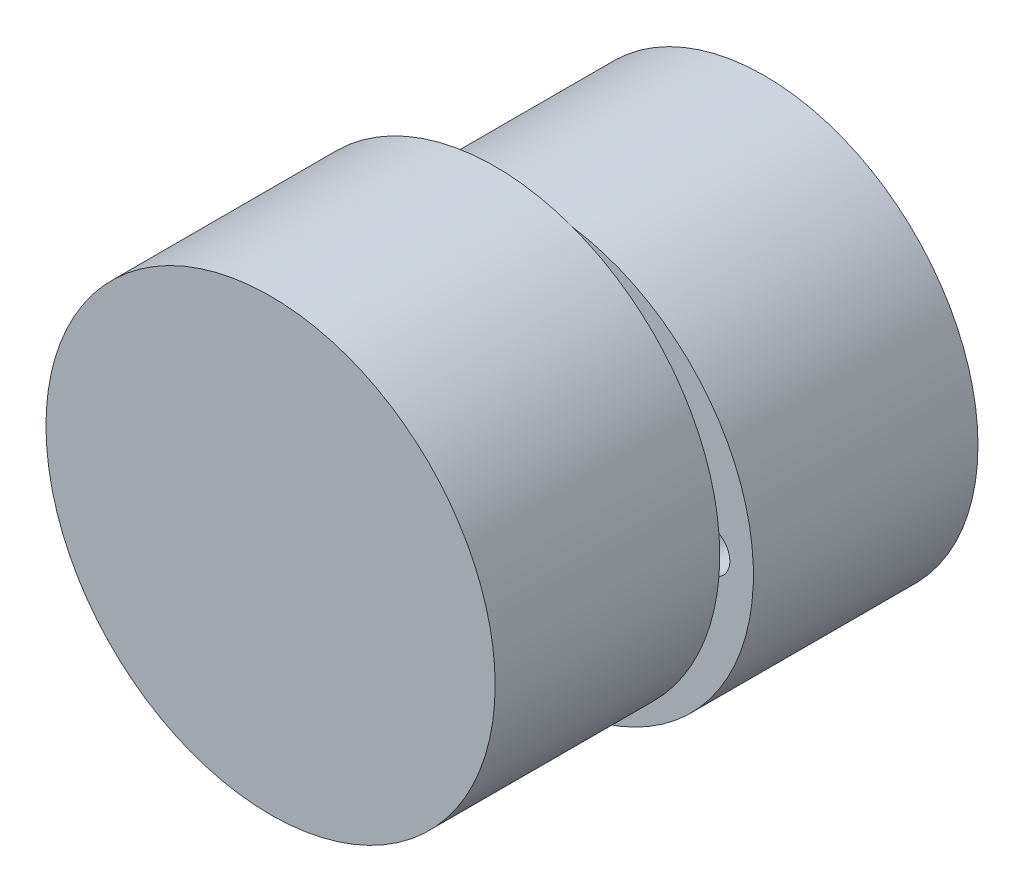
ISO-10303-21;
HEADER;
FILE_DESCRIPTION(('STEP AP214'),'2;1');
FILE_NAME('part.step','',(''),(''),'','','');
FILE_SCHEMA(('AUTOMOTIVE_DESIGN { 1 0 10303 214 1 1 1 1 }'));
ENDSEC;
DATA;
#1=APPLICATION_CONTEXT('core data for automotive mechanical design processes');
#2=APPLICATION_PROTOCOL_DEFINITION('international standard','automotive_design',2000,#1);
#3=PRODUCT_CONTEXT('',#1,'mechanical');
#4=PRODUCT('Part','Part','',(#3));
#5=PRODUCT_RELATED_PRODUCT_CATEGORY('part','',(#4));
#6=PRODUCT_DEFINITION_FORMATION('','',#4);
#7=PRODUCT_DEFINITION_CONTEXT('part definition',#1,'design');
#8=PRODUCT_DEFINITION('design','',#6,#7);
#9=PRODUCT_DEFINITION_SHAPE('','',#8);
#10=(LENGTH_UNIT() NAMED_UNIT(*) SI_UNIT(.MILLI.,.METRE.));
#11=(NAMED_UNIT(*) PLANE_ANGLE_UNIT() SI_UNIT($,.RADIAN.));
#12=(NAMED_UNIT(*) SI_UNIT($,.STERADIAN.) SOLID_ANGLE_UNIT());
#13=UNCERTAINTY_MEASURE_WITH_UNIT(LENGTH_MEASURE(1.E-05),#10,'distance_accuracy_value','');
#14=(GEOMETRIC_REPRESENTATION_CONTEXT(3) GLOBAL_UNCERTAINTY_ASSIGNED_CONTEXT((#13)) GLOBAL_UNIT_ASSIGNED_CONTEXT((#10,
#11,#12)) REPRESENTATION_CONTEXT('',''));
#15=CARTESIAN_POINT('',(0.,0.,0.));
#16=DIRECTION('',(0.,0.,1.));
#17=DIRECTION('',(1.,0.,0.));
#18=AXIS2_PLACEMENT_3D('',#15,#16,#17);
#19=CARTESIAN_POINT('',(0.,0.,10.));
#20=DIRECTION('',(0.,0.,1.));
#21=DIRECTION('',(1.,0.,0.));
#22=AXIS2_PLACEMENT_3D('',#19,#20,#21);
#23=PLANE('',#22);
#24=CARTESIAN_POINT('',(-2.,0.,10.));
#25=DIRECTION('',(0.,0.,1.));
#26=DIRECTION('',(1.,0.,0.));
#27=AXIS2_PLACEMENT_3D('',#24,#25,#26);
#28=CIRCLE('',#27,10.);
#29=CARTESIAN_POINT('',(7.96565789473685,0.828047537928324,10.));
#30=VERTEX_POINT('',#29);
#31=CARTESIAN_POINT('',(1.4375,9.39061200082295,10.));
#32=VERTEX_POINT('',#31);
#33=EDGE_CURVE('E46',#30,#32,#28,.T.);
#34=ORIENTED_EDGE('',*,*,#33,.F.);
#35=CARTESIAN_POINT('',(7.5,0.,10.));
#36=DIRECTION('',(0.,0.,1.));
#37=DIRECTION('',(1.,0.,0.));
#38=AXIS2_PLACEMENT_3D('',#35,#36,#37);
#39=CIRCLE('',#38,0.95);
#40=CARTESIAN_POINT('',(7.96565789473684,-0.828047537928434,10.));
#41=VERTEX_POINT('',#40);
#42=EDGE_CURVE('E68',#41,#30,#39,.T.);
#43=ORIENTED_EDGE('',*,*,#42,.F.);
#44=CARTESIAN_POINT('',(1.4375,-9.39061200082295,10.));
#45=VERTEX_POINT('',#44);
#46=EDGE_CURVE('E11',#45,#41,#28,.T.);
#47=ORIENTED_EDGE('',*,*,#46,.F.);
#48=CARTESIAN_POINT('',(0.,0.,10.));
#49=DIRECTION('',(0.,0.,1.));
#50=DIRECTION('',(1.,0.,0.));
#51=AXIS2_PLACEMENT_3D('',#48,#49,#50);
#52=CIRCLE('',#51,9.5);
#53=EDGE_CURVE('E56',#45,#32,#52,.T.);
#54=ORIENTED_EDGE('',*,*,#53,.T.);
#55=EDGE_LOOP('',(#34,#43,#47,#54));
#56=FACE_BOUND('',#55,.T.);
#57=ADVANCED_FACE('F35',(#56),#23,.T.);
#58=CARTESIAN_POINT('',(0.,0.,0.));
#59=DIRECTION('',(0.,0.,1.));
#60=DIRECTION('',(1.,0.,0.));
#61=AXIS2_PLACEMENT_3D('',#58,#59,#60);
#62=PLANE('',#61);
#63=CARTESIAN_POINT('',(0.,0.,0.));
#64=DIRECTION('',(0.,0.,-1.));
#65=DIRECTION('',(-1.,0.,0.));
#66=AXIS2_PLACEMENT_3D('',#63,#64,#65);
#67=CIRCLE('',#66,5.5);
#68=CARTESIAN_POINT('',(-5.5,0.,0.));
#69=VERTEX_POINT('',#68);
#70=EDGE_CURVE('E266',#69,#69,#67,.T.);
#71=ORIENTED_EDGE('',*,*,#70,.F.);
#72=EDGE_LOOP('',(#71));
#73=FACE_BOUND('',#72,.T.);
#74=CARTESIAN_POINT('',(0.,0.,0.));
#75=DIRECTION('',(0.,0.,1.));
#76=DIRECTION('',(1.,0.,0.));
#77=AXIS2_PLACEMENT_3D('',#74,#75,#76);
#78=CIRCLE('',#77,9.5);
#79=CARTESIAN_POINT('',(9.5,0.,0.));
#80=VERTEX_POINT('',#79);
#81=EDGE_CURVE('E132',#80,#80,#78,.T.);
#82=ORIENTED_EDGE('',*,*,#81,.F.);
#83=EDGE_LOOP('',(#82));
#84=FACE_BOUND('',#83,.T.);
#85=CARTESIAN_POINT('',(-7.5,0.,0.));
#86=DIRECTION('',(0.,0.,1.));
#87=DIRECTION('',(1.,0.,0.));
#88=AXIS2_PLACEMENT_3D('',#85,#86,#87);
#89=CIRCLE('',#88,0.95);
#90=CARTESIAN_POINT('',(-6.55,0.,0.));
#91=VERTEX_POINT('',#90);
#92=EDGE_CURVE('E127',#91,#91,#89,.T.);
#93=ORIENTED_EDGE('',*,*,#92,.T.);
#94=EDGE_LOOP('',(#93));
#95=FACE_BOUND('',#94,.T.);
#96=CARTESIAN_POINT('',(-5.3033008588991,5.30330085889912,0.));
#97=DIRECTION('',(0.,0.,1.));
#98=DIRECTION('',(1.,0.,0.));
#99=AXIS2_PLACEMENT_3D('',#96,#97,#98);
#100=CIRCLE('',#99,0.95);
#101=CARTESIAN_POINT('',(-4.3533008588991,5.30330085889912,0.));
#102=VERTEX_POINT('',#101);
#103=EDGE_CURVE('E121',#102,#102,#100,.T.);
#104=ORIENTED_EDGE('',*,*,#103,.T.);
#105=EDGE_LOOP('',(#104));
#106=FACE_BOUND('',#105,.T.);
#107=CARTESIAN_POINT('',(0.,7.5,0.));
#108=DIRECTION('',(0.,0.,1.));
#109=DIRECTION('',(1.,0.,0.));
#110=AXIS2_PLACEMENT_3D('',#107,#108,#109);
#111=CIRCLE('',#110,0.95);
#112=CARTESIAN_POINT('',(0.950000000000026,7.5,0.));
#113=VERTEX_POINT('',#112);
#114=EDGE_CURVE('E115',#113,#113,#111,.T.);
#115=ORIENTED_EDGE('',*,*,#114,.T.);
#116=EDGE_LOOP('',(#115));
#117=FACE_BOUND('',#116,.T.);
#118=CARTESIAN_POINT('',(5.30330085889913,5.30330085889908,0.));
#119=DIRECTION('',(0.,0.,1.));
#120=DIRECTION('',(1.,0.,0.));
#121=AXIS2_PLACEMENT_3D('',#118,#119,#120);
#122=CIRCLE('',#121,0.95);
#123=CARTESIAN_POINT('',(6.25330085889913,5.30330085889908,0.));
#124=VERTEX_POINT('',#123);
#125=EDGE_CURVE('E72',#124,#124,#122,.T.);
#126=ORIENTED_EDGE('',*,*,#125,.T.);
#127=EDGE_LOOP('',(#126));
#128=FACE_BOUND('',#127,.T.);
#129=CARTESIAN_POINT('',(7.5,0.,0.));
#130=DIRECTION('',(0.,0.,1.));
#131=DIRECTION('',(1.,0.,0.));
#132=AXIS2_PLACEMENT_3D('',#129,#130,#131);
#133=CIRCLE('',#132,0.95);
#134=CARTESIAN_POINT('',(8.45,0.,0.));
#135=VERTEX_POINT('',#134);
#136=EDGE_CURVE('E75',#135,#135,#133,.T.);
#137=ORIENTED_EDGE('',*,*,#136,.T.);
#138=EDGE_LOOP('',(#137));
#139=FACE_BOUND('',#138,.T.);
#140=CARTESIAN_POINT('',(5.30330085889906,-5.30330085889915,0.));
#141=DIRECTION('',(0.,0.,1.));
#142=DIRECTION('',(1.,0.,0.));
#143=AXIS2_PLACEMENT_3D('',#140,#141,#142);
#144=CIRCLE('',#143,0.95);
#145=CARTESIAN_POINT('',(6.25330085889906,-5.30330085889915,0.));
#146=VERTEX_POINT('',#145);
#147=EDGE_CURVE('E102',#146,#146,#144,.T.);
#148=ORIENTED_EDGE('',*,*,#147,.T.);
#149=EDGE_LOOP('',(#148));
#150=FACE_BOUND('',#149,.T.);
#151=CARTESIAN_POINT('',(0.,-7.5,0.));
#152=DIRECTION('',(0.,0.,1.));
#153=DIRECTION('',(1.,0.,0.));
#154=AXIS2_PLACEMENT_3D('',#151,#152,#153);
#155=CIRCLE('',#154,0.95);
#156=CARTESIAN_POINT('',(0.949999999999921,-7.5,0.));
#157=VERTEX_POINT('',#156);
#158=EDGE_CURVE('E95',#157,#157,#155,.T.);
#159=ORIENTED_EDGE('',*,*,#158,.T.);
#160=EDGE_LOOP('',(#159));
#161=FACE_BOUND('',#160,.T.);
#162=CARTESIAN_POINT('',(-5.30330085889917,-5.30330085889904,0.));
#163=DIRECTION('',(0.,0.,1.));
#164=DIRECTION('',(1.,0.,0.));
#165=AXIS2_PLACEMENT_3D('',#162,#163,#164);
#166=CIRCLE('',#165,0.950000000000001);
#167=CARTESIAN_POINT('',(-4.35330085889917,-5.30330085889904,0.));
#168=VERTEX_POINT('',#167);
#169=EDGE_CURVE('E92',#168,#168,#166,.T.);
#170=ORIENTED_EDGE('',*,*,#169,.T.);
#171=EDGE_LOOP('',(#170));
#172=FACE_BOUND('',#171,.T.);
#173=ADVANCED_FACE('F139',(#73,#84,#95,#106,#117,#128,#139,#150,#161,#172),#62,.F.);
#174=CARTESIAN_POINT('',(0.,0.,10.));
#175=DIRECTION('',(0.,0.,-1.));
#176=DIRECTION('',(-1.,0.,0.));
#177=AXIS2_PLACEMENT_3D('',#174,#175,#176);
#178=CYLINDRICAL_SURFACE('',#177,9.5);
#179=EDGE_CURVE('E44',#32,#45,#52,.T.);
#180=ORIENTED_EDGE('',*,*,#179,.F.);
#181=ORIENTED_EDGE('',*,*,#53,.F.);
#182=EDGE_LOOP('',(#180,#181));
#183=FACE_BOUND('',#182,.T.);
#184=ORIENTED_EDGE('',*,*,#81,.T.);
#185=EDGE_LOOP('',(#184));
#186=FACE_BOUND('',#185,.T.);
#187=ADVANCED_FACE('F37',(#183,#186),#178,.T.);
#188=CARTESIAN_POINT('',(-7.5,0.,10.));
#189=DIRECTION('',(0.,0.,-1.));
#190=DIRECTION('',(-1.,0.,0.));
#191=AXIS2_PLACEMENT_3D('',#188,#189,#190);
#192=CYLINDRICAL_SURFACE('',#191,0.95);
#193=CARTESIAN_POINT('',(-7.5,0.,10.));
#194=DIRECTION('',(0.,0.,1.));
#195=DIRECTION('',(1.,0.,0.));
#196=AXIS2_PLACEMENT_3D('',#193,#194,#195);
#197=CIRCLE('',#196,0.95);
#198=CARTESIAN_POINT('',(-6.55,0.,10.));
#199=VERTEX_POINT('',#198);
#200=EDGE_CURVE('E118',#199,#199,#197,.T.);
#201=ORIENTED_EDGE('',*,*,#200,.T.);
#202=EDGE_LOOP('',(#201));
#203=FACE_BOUND('',#202,.T.);
#204=ORIENTED_EDGE('',*,*,#92,.F.);
#205=EDGE_LOOP('',(#204));
#206=FACE_BOUND('',#205,.T.);
#207=ADVANCED_FACE('F185',(#203,#206),#192,.F.);
#208=CARTESIAN_POINT('',(-5.3033008588991,5.30330085889912,10.));
#209=DIRECTION('',(0.,0.,-1.));
#210=DIRECTION('',(-1.,0.,0.));
#211=AXIS2_PLACEMENT_3D('',#208,#209,#210);
#212=CYLINDRICAL_SURFACE('',#211,0.95);
#213=CARTESIAN_POINT('',(-5.3033008588991,5.30330085889912,10.));
#214=DIRECTION('',(0.,0.,1.));
#215=DIRECTION('',(1.,0.,0.));
#216=AXIS2_PLACEMENT_3D('',#213,#214,#215);
#217=CIRCLE('',#216,0.95);
#218=CARTESIAN_POINT('',(-4.3533008588991,5.30330085889912,10.));
#219=VERTEX_POINT('',#218);
#220=EDGE_CURVE('E112',#219,#219,#217,.T.);
#221=ORIENTED_EDGE('',*,*,#220,.T.);
#222=EDGE_LOOP('',(#221));
#223=FACE_BOUND('',#222,.T.);
#224=ORIENTED_EDGE('',*,*,#103,.F.);
#225=EDGE_LOOP('',(#224));
#226=FACE_BOUND('',#225,.T.);
#227=ADVANCED_FACE('F188',(#223,#226),#212,.F.);
#228=CARTESIAN_POINT('',(0.,7.5,10.));
#229=DIRECTION('',(0.,0.,-1.));
#230=DIRECTION('',(-1.,0.,0.));
#231=AXIS2_PLACEMENT_3D('',#228,#229,#230);
#232=CYLINDRICAL_SURFACE('',#231,0.95);
#233=CARTESIAN_POINT('',(0.,7.5,10.));
#234=DIRECTION('',(0.,0.,1.));
#235=DIRECTION('',(1.,0.,0.));
#236=AXIS2_PLACEMENT_3D('',#233,#234,#235);
#237=CIRCLE('',#236,0.95);
#238=CARTESIAN_POINT('',(0.950000000000026,7.5,10.));
#239=VERTEX_POINT('',#238);
#240=EDGE_CURVE('E99',#239,#239,#237,.T.);
#241=ORIENTED_EDGE('',*,*,#240,.T.);
#242=EDGE_LOOP('',(#241));
#243=FACE_BOUND('',#242,.T.);
#244=ORIENTED_EDGE('',*,*,#114,.F.);
#245=EDGE_LOOP('',(#244));
#246=FACE_BOUND('',#245,.T.);
#247=ADVANCED_FACE('F192',(#243,#246),#232,.F.);
#248=CARTESIAN_POINT('',(5.30330085889913,5.30330085889908,10.));
#249=DIRECTION('',(0.,0.,-1.));
#250=DIRECTION('',(-1.,0.,0.));
#251=AXIS2_PLACEMENT_3D('',#248,#249,#250);
#252=CYLINDRICAL_SURFACE('',#251,0.95);
#253=CARTESIAN_POINT('',(5.30330085889913,5.30330085889908,10.));
#254=DIRECTION('',(0.,0.,1.));
#255=DIRECTION('',(1.,0.,0.));
#256=AXIS2_PLACEMENT_3D('',#253,#254,#255);
#257=CIRCLE('',#256,0.95);
#258=CARTESIAN_POINT('',(6.25330085889913,5.30330085889908,10.));
#259=VERTEX_POINT('',#258);
#260=EDGE_CURVE('E105',#259,#259,#257,.T.);
#261=ORIENTED_EDGE('',*,*,#260,.T.);
#262=EDGE_LOOP('',(#261));
#263=FACE_BOUND('',#262,.T.);
#264=ORIENTED_EDGE('',*,*,#125,.F.);
#265=EDGE_LOOP('',(#264));
#266=FACE_BOUND('',#265,.T.);
#267=ADVANCED_FACE('F196',(#263,#266),#252,.F.);
#268=CARTESIAN_POINT('',(7.5,0.,10.));
#269=DIRECTION('',(0.,0.,-1.));
#270=DIRECTION('',(-1.,0.,0.));
#271=AXIS2_PLACEMENT_3D('',#268,#269,#270);
#272=CYLINDRICAL_SURFACE('',#271,0.95);
#273=EDGE_CURVE('E65',#30,#41,#39,.T.);
#274=ORIENTED_EDGE('',*,*,#273,.T.);
#275=ORIENTED_EDGE('',*,*,#42,.T.);
#276=EDGE_LOOP('',(#274,#275));
#277=FACE_BOUND('',#276,.T.);
#278=ORIENTED_EDGE('',*,*,#136,.F.);
#279=EDGE_LOOP('',(#278));
#280=FACE_BOUND('',#279,.T.);
#281=ADVANCED_FACE('F66',(#277,#280),#272,.F.);
#282=CARTESIAN_POINT('',(5.30330085889906,-5.30330085889915,10.));
#283=DIRECTION('',(0.,0.,-1.));
#284=DIRECTION('',(-1.,0.,0.));
#285=AXIS2_PLACEMENT_3D('',#282,#283,#284);
#286=CYLINDRICAL_SURFACE('',#285,0.95);
#287=CARTESIAN_POINT('',(5.30330085889906,-5.30330085889915,10.));
#288=DIRECTION('',(0.,0.,1.));
#289=DIRECTION('',(1.,0.,0.));
#290=AXIS2_PLACEMENT_3D('',#287,#288,#289);
#291=CIRCLE('',#290,0.95);
#292=CARTESIAN_POINT('',(6.25330085889906,-5.30330085889915,10.));
#293=VERTEX_POINT('',#292);
#294=EDGE_CURVE('E91',#293,#293,#291,.T.);
#295=ORIENTED_EDGE('',*,*,#294,.T.);
#296=EDGE_LOOP('',(#295));
#297=FACE_BOUND('',#296,.T.);
#298=ORIENTED_EDGE('',*,*,#147,.F.);
#299=EDGE_LOOP('',(#298));
#300=FACE_BOUND('',#299,.T.);
#301=ADVANCED_FACE('F171',(#297,#300),#286,.F.);
#302=CARTESIAN_POINT('',(0.,-7.5,10.));
#303=DIRECTION('',(0.,0.,-1.));
#304=DIRECTION('',(-1.,0.,0.));
#305=AXIS2_PLACEMENT_3D('',#302,#303,#304);
#306=CYLINDRICAL_SURFACE('',#305,0.95);
#307=CARTESIAN_POINT('',(0.,-7.5,10.));
#308=DIRECTION('',(0.,0.,1.));
#309=DIRECTION('',(1.,0.,0.));
#310=AXIS2_PLACEMENT_3D('',#307,#308,#309);
#311=CIRCLE('',#310,0.95);
#312=CARTESIAN_POINT('',(0.949999999999921,-7.5,10.));
#313=VERTEX_POINT('',#312);
#314=EDGE_CURVE('E96',#313,#313,#311,.T.);
#315=ORIENTED_EDGE('',*,*,#314,.T.);
#316=EDGE_LOOP('',(#315));
#317=FACE_BOUND('',#316,.T.);
#318=ORIENTED_EDGE('',*,*,#158,.F.);
#319=EDGE_LOOP('',(#318));
#320=FACE_BOUND('',#319,.T.);
#321=ADVANCED_FACE('F162',(#317,#320),#306,.F.);
#322=CARTESIAN_POINT('',(-5.30330085889917,-5.30330085889904,10.));
#323=DIRECTION('',(0.,0.,-1.));
#324=DIRECTION('',(-1.,0.,0.));
#325=AXIS2_PLACEMENT_3D('',#322,#323,#324);
#326=CYLINDRICAL_SURFACE('',#325,0.950000000000001);
#327=CARTESIAN_POINT('',(-5.30330085889917,-5.30330085889904,10.));
#328=DIRECTION('',(0.,0.,1.));
#329=DIRECTION('',(1.,0.,0.));
#330=AXIS2_PLACEMENT_3D('',#327,#328,#329);
#331=CIRCLE('',#330,0.950000000000001);
#332=CARTESIAN_POINT('',(-4.35330085889917,-5.30330085889904,10.));
#333=VERTEX_POINT('',#332);
#334=EDGE_CURVE('E88',#333,#333,#331,.T.);
#335=ORIENTED_EDGE('',*,*,#334,.T.);
#336=EDGE_LOOP('',(#335));
#337=FACE_BOUND('',#336,.T.);
#338=ORIENTED_EDGE('',*,*,#169,.F.);
#339=EDGE_LOOP('',(#338));
#340=FACE_BOUND('',#339,.T.);
#341=ADVANCED_FACE('F159',(#337,#340),#326,.F.);
#342=CARTESIAN_POINT('',(-2.,0.,20.));
#343=DIRECTION('',(0.,0.,1.));
#344=DIRECTION('',(1.,0.,0.));
#345=AXIS2_PLACEMENT_3D('',#342,#343,#344);
#346=PLANE('',#345);
#347=CARTESIAN_POINT('',(-2.,0.,20.));
#348=DIRECTION('',(0.,0.,1.));
#349=DIRECTION('',(1.,0.,0.));
#350=AXIS2_PLACEMENT_3D('',#347,#348,#349);
#351=CIRCLE('',#350,10.);
#352=CARTESIAN_POINT('',(8.,0.,20.));
#353=VERTEX_POINT('',#352);
#354=EDGE_CURVE('E84',#353,#353,#351,.T.);
#355=ORIENTED_EDGE('',*,*,#354,.T.);
#356=EDGE_LOOP('',(#355));
#357=FACE_BOUND('',#356,.T.);
#358=ADVANCED_FACE('F161',(#357),#346,.T.);
#359=CARTESIAN_POINT('',(-2.,0.,20.));
#360=DIRECTION('',(0.,0.,-1.));
#361=DIRECTION('',(-1.,0.,0.));
#362=AXIS2_PLACEMENT_3D('',#359,#360,#361);
#363=CYLINDRICAL_SURFACE('',#362,10.);
#364=ORIENTED_EDGE('',*,*,#354,.F.);
#365=EDGE_LOOP('',(#364));
#366=FACE_BOUND('',#365,.T.);
#367=ORIENTED_EDGE('',*,*,#33,.T.);
#368=EDGE_CURVE('E47',#32,#45,#28,.T.);
#369=ORIENTED_EDGE('',*,*,#368,.T.);
#370=ORIENTED_EDGE('',*,*,#46,.T.);
#371=EDGE_CURVE('E76',#41,#30,#28,.T.);
#372=ORIENTED_EDGE('',*,*,#371,.T.);
#373=EDGE_LOOP('',(#367,#369,#370,#372));
#374=FACE_BOUND('',#373,.T.);
#375=ADVANCED_FACE('F80',(#366,#374),#363,.T.);
#376=CARTESIAN_POINT('',(-2.,0.,10.));
#377=DIRECTION('',(0.,0.,1.));
#378=DIRECTION('',(1.,0.,0.));
#379=AXIS2_PLACEMENT_3D('',#376,#377,#378);
#380=PLANE('',#379);
#381=ORIENTED_EDGE('',*,*,#368,.F.);
#382=ORIENTED_EDGE('',*,*,#179,.T.);
#383=EDGE_LOOP('',(#381,#382));
#384=FACE_BOUND('',#383,.T.);
#385=ADVANCED_FACE('F225',(#384),#380,.F.);
#386=ORIENTED_EDGE('',*,*,#273,.F.);
#387=ORIENTED_EDGE('',*,*,#371,.F.);
#388=EDGE_LOOP('',(#386,#387));
#389=FACE_BOUND('',#388,.T.);
#390=ADVANCED_FACE('F77',(#389),#380,.F.);
#391=ORIENTED_EDGE('',*,*,#334,.F.);
#392=EDGE_LOOP('',(#391));
#393=FACE_BOUND('',#392,.T.);
#394=ADVANCED_FACE('F213',(#393),#380,.F.);
#395=ORIENTED_EDGE('',*,*,#294,.F.);
#396=EDGE_LOOP('',(#395));
#397=FACE_BOUND('',#396,.T.);
#398=ADVANCED_FACE('F210',(#397),#380,.F.);
#399=ORIENTED_EDGE('',*,*,#260,.F.);
#400=EDGE_LOOP('',(#399));
#401=FACE_BOUND('',#400,.T.);
#402=ADVANCED_FACE('F212',(#401),#380,.F.);
#403=ORIENTED_EDGE('',*,*,#220,.F.);
#404=EDGE_LOOP('',(#403));
#405=FACE_BOUND('',#404,.T.);
#406=ADVANCED_FACE('F219',(#405),#380,.F.);
#407=ORIENTED_EDGE('',*,*,#200,.F.);
#408=EDGE_LOOP('',(#407));
#409=FACE_BOUND('',#408,.T.);
#410=ADVANCED_FACE('F230',(#409),#380,.F.);
#411=ORIENTED_EDGE('',*,*,#240,.F.);
#412=EDGE_LOOP('',(#411));
#413=FACE_BOUND('',#412,.T.);
#414=ADVANCED_FACE('F231',(#413),#380,.F.);
#415=ORIENTED_EDGE('',*,*,#314,.F.);
#416=EDGE_LOOP('',(#415));
#417=FACE_BOUND('',#416,.T.);
#418=ADVANCED_FACE('F222',(#417),#380,.F.);
#419=CARTESIAN_POINT('',(0.,0.,1.2));
#420=DIRECTION('',(0.,0.,-1.));
#421=DIRECTION('',(-1.,0.,0.));
#422=AXIS2_PLACEMENT_3D('',#419,#420,#421);
#423=CYLINDRICAL_SURFACE('',#422,5.5);
#424=CARTESIAN_POINT('',(0.,0.,1.2));
#425=DIRECTION('',(0.,0.,-1.));
#426=DIRECTION('',(-1.,0.,0.));
#427=AXIS2_PLACEMENT_3D('',#424,#425,#426);
#428=CIRCLE('',#427,5.5);
#429=CARTESIAN_POINT('',(-5.5,0.,1.2));
#430=VERTEX_POINT('',#429);
#431=EDGE_CURVE('E263',#430,#430,#428,.T.);
#432=ORIENTED_EDGE('',*,*,#431,.F.);
#433=EDGE_LOOP('',(#432));
#434=FACE_BOUND('',#433,.T.);
#435=ORIENTED_EDGE('',*,*,#70,.T.);
#436=EDGE_LOOP('',(#435));
#437=FACE_BOUND('',#436,.T.);
#438=ADVANCED_FACE('F244',(#434,#437),#423,.F.);
#439=CARTESIAN_POINT('',(0.,0.,1.2));
#440=DIRECTION('',(0.,0.,-1.));
#441=DIRECTION('',(-1.,0.,0.));
#442=AXIS2_PLACEMENT_3D('',#439,#440,#441);
#443=PLANE('',#442);
#444=CARTESIAN_POINT('',(0.,0.,1.2));
#445=DIRECTION('',(0.,0.,-1.));
#446=DIRECTION('',(-1.,0.,0.));
#447=AXIS2_PLACEMENT_3D('',#444,#445,#446);
#448=CIRCLE('',#447,1.6);
#449=CARTESIAN_POINT('',(-1.6,0.,1.2));
#450=VERTEX_POINT('',#449);
#451=EDGE_CURVE('E39',#450,#450,#448,.T.);
#452=ORIENTED_EDGE('',*,*,#451,.F.);
#453=EDGE_LOOP('',(#452));
#454=FACE_BOUND('',#453,.T.);
#455=ORIENTED_EDGE('',*,*,#431,.T.);
#456=EDGE_LOOP('',(#455));
#457=FACE_BOUND('',#456,.T.);
#458=ADVANCED_FACE('F251',(#454,#457),#443,.T.);
#459=CARTESIAN_POINT('',(0.,0.,10.));
#460=DIRECTION('',(0.,0.,1.));
#461=DIRECTION('',(1.,0.,0.));
#462=AXIS2_PLACEMENT_3D('',#459,#460,#461);
#463=CIRCLE('',#462,1.6);
#464=CARTESIAN_POINT('',(1.6,0.,10.));
#465=VERTEX_POINT('',#464);
#466=EDGE_CURVE('E124',#465,#465,#463,.T.);
#467=ORIENTED_EDGE('',*,*,#466,.F.);
#468=EDGE_LOOP('',(#467));
#469=FACE_BOUND('',#468,.T.);
#470=ADVANCED_FACE('F183',(#469),#380,.F.);
#471=CARTESIAN_POINT('',(0.,0.,10.));
#472=DIRECTION('',(0.,0.,-1.));
#473=DIRECTION('',(-1.,0.,0.));
#474=AXIS2_PLACEMENT_3D('',#471,#472,#473);
#475=CYLINDRICAL_SURFACE('',#474,1.6);
#476=ORIENTED_EDGE('',*,*,#466,.T.);
#477=EDGE_LOOP('',(#476));
#478=FACE_BOUND('',#477,.T.);
#479=ORIENTED_EDGE('',*,*,#451,.T.);
#480=EDGE_LOOP('',(#479));
#481=FACE_BOUND('',#480,.T.);
#482=ADVANCED_FACE('F180',(#478,#481),#475,.F.);
#483=CLOSED_SHELL('',(#57,#173,#187,#207,#227,#247,#267,#281,#301,#321,#341,#358,#375,#385,#390,
#394,#398,#402,#406,#410,#414,#418,#438,#458,#470,#482));
#484=MANIFOLD_SOLID_BREP('B2',#483);
#485=ADVANCED_BREP_SHAPE_REPRESENTATION('',(#18,#484),#14);
#486=SHAPE_DEFINITION_REPRESENTATION(#9,#485);
ENDSEC;
END-ISO-10303-21;
